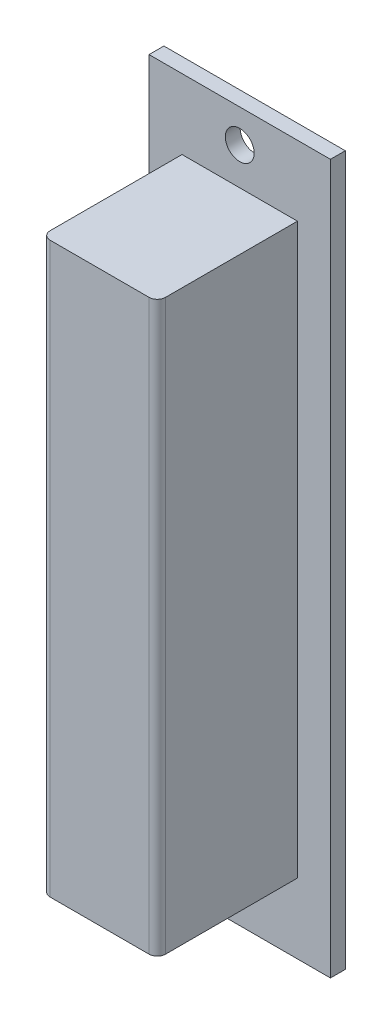
ISO-10303-21;
HEADER;
FILE_DESCRIPTION(('STEP AP214'),'2;1');
FILE_NAME('part.step','',(''),(''),'','','');
FILE_SCHEMA(('AUTOMOTIVE_DESIGN { 1 0 10303 214 1 1 1 1 }'));
ENDSEC;
DATA;
#1=APPLICATION_CONTEXT('core data for automotive mechanical design processes');
#2=APPLICATION_PROTOCOL_DEFINITION('international standard','automotive_design',2000,#1);
#3=PRODUCT_CONTEXT('',#1,'mechanical');
#4=PRODUCT('Part','Part','',(#3));
#5=PRODUCT_RELATED_PRODUCT_CATEGORY('part','',(#4));
#6=PRODUCT_DEFINITION_FORMATION('','',#4);
#7=PRODUCT_DEFINITION_CONTEXT('part definition',#1,'design');
#8=PRODUCT_DEFINITION('design','',#6,#7);
#9=PRODUCT_DEFINITION_SHAPE('','',#8);
#10=(LENGTH_UNIT() NAMED_UNIT(*) SI_UNIT(.MILLI.,.METRE.));
#11=(NAMED_UNIT(*) PLANE_ANGLE_UNIT() SI_UNIT($,.RADIAN.));
#12=(NAMED_UNIT(*) SI_UNIT($,.STERADIAN.) SOLID_ANGLE_UNIT());
#13=UNCERTAINTY_MEASURE_WITH_UNIT(LENGTH_MEASURE(1.E-05),#10,'distance_accuracy_value','');
#14=(GEOMETRIC_REPRESENTATION_CONTEXT(3) GLOBAL_UNCERTAINTY_ASSIGNED_CONTEXT((#13)) GLOBAL_UNIT_ASSIGNED_CONTEXT((#10,
#11,#12)) REPRESENTATION_CONTEXT('',''));
#15=CARTESIAN_POINT('',(0.,0.,0.));
#16=DIRECTION('',(0.,0.,1.));
#17=DIRECTION('',(1.,0.,0.));
#18=AXIS2_PLACEMENT_3D('',#15,#16,#17);
#19=CARTESIAN_POINT('',(-11.,-43.,1.8));
#20=DIRECTION('',(0.,0.,1.));
#21=DIRECTION('',(1.,0.,0.));
#22=AXIS2_PLACEMENT_3D('',#19,#20,#21);
#23=PLANE('',#22);
#24=CARTESIAN_POINT('',(0.,-39.,1.8));
#25=DIRECTION('',(0.,0.,1.));
#26=DIRECTION('',(-1.,0.,0.));
#27=AXIS2_PLACEMENT_3D('',#24,#25,#26);
#28=CIRCLE('',#27,1.75);
#29=CARTESIAN_POINT('',(-1.75,-39.,1.8));
#30=VERTEX_POINT('',#29);
#31=EDGE_CURVE('E141',#30,#30,#28,.T.);
#32=ORIENTED_EDGE('',*,*,#31,.F.);
#33=EDGE_LOOP('',(#32));
#34=FACE_BOUND('',#33,.T.);
#35=DIRECTION('',(0.,-1.,0.));
#36=VECTOR('',#35,1.);
#37=CARTESIAN_POINT('',(-11.,43.,1.8));
#38=LINE('',#37,#36);
#39=CARTESIAN_POINT('',(-11.,43.,1.8));
#40=VERTEX_POINT('',#39);
#41=CARTESIAN_POINT('',(-11.,-43.,1.8));
#42=VERTEX_POINT('',#41);
#43=EDGE_CURVE('E159',#40,#42,#38,.T.);
#44=ORIENTED_EDGE('',*,*,#43,.T.);
#45=DIRECTION('',(1.,0.,0.));
#46=VECTOR('',#45,1.);
#47=CARTESIAN_POINT('',(-11.,-43.,1.8));
#48=LINE('',#47,#46);
#49=CARTESIAN_POINT('',(11.,-43.,1.8));
#50=VERTEX_POINT('',#49);
#51=EDGE_CURVE('E162',#42,#50,#48,.T.);
#52=ORIENTED_EDGE('',*,*,#51,.T.);
#53=DIRECTION('',(0.,1.,0.));
#54=VECTOR('',#53,1.);
#55=CARTESIAN_POINT('',(11.,-43.,1.8));
#56=LINE('',#55,#54);
#57=CARTESIAN_POINT('',(11.,43.,1.8));
#58=VERTEX_POINT('',#57);
#59=EDGE_CURVE('E164',#50,#58,#56,.T.);
#60=ORIENTED_EDGE('',*,*,#59,.T.);
#61=DIRECTION('',(-1.,0.,0.));
#62=VECTOR('',#61,1.);
#63=CARTESIAN_POINT('',(-11.,43.,1.8));
#64=LINE('',#63,#62);
#65=EDGE_CURVE('E166',#58,#40,#64,.T.);
#66=ORIENTED_EDGE('',*,*,#65,.T.);
#67=EDGE_LOOP('',(#44,#52,#60,#66));
#68=FACE_BOUND('',#67,.T.);
#69=CARTESIAN_POINT('',(0.,39.,1.8));
#70=DIRECTION('',(0.,0.,1.));
#71=DIRECTION('',(1.,0.,0.));
#72=AXIS2_PLACEMENT_3D('',#69,#70,#71);
#73=CIRCLE('',#72,1.75);
#74=CARTESIAN_POINT('',(1.75,39.,1.8));
#75=VERTEX_POINT('',#74);
#76=EDGE_CURVE('E147',#75,#75,#73,.T.);
#77=ORIENTED_EDGE('',*,*,#76,.F.);
#78=EDGE_LOOP('',(#77));
#79=FACE_BOUND('',#78,.T.);
#80=DIRECTION('',(1.,0.,0.));
#81=VECTOR('',#80,1.);
#82=CARTESIAN_POINT('',(-7.,-34.5,1.8));
#83=LINE('',#82,#81);
#84=CARTESIAN_POINT('',(-7.,-34.5,1.8));
#85=VERTEX_POINT('',#84);
#86=CARTESIAN_POINT('',(7.00000000000002,-34.5,1.8));
#87=VERTEX_POINT('',#86);
#88=EDGE_CURVE('E108',#85,#87,#83,.T.);
#89=ORIENTED_EDGE('',*,*,#88,.F.);
#90=DIRECTION('',(0.,-1.,0.));
#91=VECTOR('',#90,1.);
#92=CARTESIAN_POINT('',(-7.,34.5,1.8));
#93=LINE('',#92,#91);
#94=CARTESIAN_POINT('',(-7.,34.5,1.8));
#95=VERTEX_POINT('',#94);
#96=EDGE_CURVE('E115',#95,#85,#93,.T.);
#97=ORIENTED_EDGE('',*,*,#96,.F.);
#98=DIRECTION('',(-1.,0.,0.));
#99=VECTOR('',#98,1.);
#100=CARTESIAN_POINT('',(-7.,34.5,1.8));
#101=LINE('',#100,#99);
#102=CARTESIAN_POINT('',(6.99999999999999,34.5,1.8));
#103=VERTEX_POINT('',#102);
#104=EDGE_CURVE('E125',#103,#95,#101,.T.);
#105=ORIENTED_EDGE('',*,*,#104,.F.);
#106=DIRECTION('',(0.,1.,0.));
#107=VECTOR('',#106,1.);
#108=CARTESIAN_POINT('',(7.00000000000002,-34.5,1.8));
#109=LINE('',#108,#107);
#110=EDGE_CURVE('E123',#87,#103,#109,.T.);
#111=ORIENTED_EDGE('',*,*,#110,.F.);
#112=EDGE_LOOP('',(#89,#97,#105,#111));
#113=FACE_BOUND('',#112,.T.);
#114=ADVANCED_FACE('F26',(#34,#68,#79,#113),#23,.T.);
#115=CARTESIAN_POINT('',(-11.,-43.,0.));
#116=DIRECTION('',(0.,0.,1.));
#117=DIRECTION('',(1.,0.,0.));
#118=AXIS2_PLACEMENT_3D('',#115,#116,#117);
#119=PLANE('',#118);
#120=CARTESIAN_POINT('',(0.,39.,0.));
#121=DIRECTION('',(0.,0.,1.));
#122=DIRECTION('',(1.,0.,0.));
#123=AXIS2_PLACEMENT_3D('',#120,#121,#122);
#124=CIRCLE('',#123,1.75);
#125=CARTESIAN_POINT('',(1.75,39.,0.));
#126=VERTEX_POINT('',#125);
#127=EDGE_CURVE('E144',#126,#126,#124,.T.);
#128=ORIENTED_EDGE('',*,*,#127,.T.);
#129=EDGE_LOOP('',(#128));
#130=FACE_BOUND('',#129,.T.);
#131=DIRECTION('',(0.,-1.,0.));
#132=VECTOR('',#131,1.);
#133=CARTESIAN_POINT('',(-11.,43.,0.));
#134=LINE('',#133,#132);
#135=CARTESIAN_POINT('',(-11.,43.,0.));
#136=VERTEX_POINT('',#135);
#137=CARTESIAN_POINT('',(-11.,-43.,0.));
#138=VERTEX_POINT('',#137);
#139=EDGE_CURVE('E150',#136,#138,#134,.T.);
#140=ORIENTED_EDGE('',*,*,#139,.F.);
#141=DIRECTION('',(-1.,0.,0.));
#142=VECTOR('',#141,1.);
#143=CARTESIAN_POINT('',(-11.,43.,0.));
#144=LINE('',#143,#142);
#145=CARTESIAN_POINT('',(11.,43.,0.));
#146=VERTEX_POINT('',#145);
#147=EDGE_CURVE('E157',#146,#136,#144,.T.);
#148=ORIENTED_EDGE('',*,*,#147,.F.);
#149=DIRECTION('',(0.,1.,0.));
#150=VECTOR('',#149,1.);
#151=CARTESIAN_POINT('',(11.,-43.,0.));
#152=LINE('',#151,#150);
#153=CARTESIAN_POINT('',(11.,-43.,0.));
#154=VERTEX_POINT('',#153);
#155=EDGE_CURVE('E155',#154,#146,#152,.T.);
#156=ORIENTED_EDGE('',*,*,#155,.F.);
#157=DIRECTION('',(1.,0.,0.));
#158=VECTOR('',#157,1.);
#159=CARTESIAN_POINT('',(-11.,-43.,0.));
#160=LINE('',#159,#158);
#161=EDGE_CURVE('E153',#138,#154,#160,.T.);
#162=ORIENTED_EDGE('',*,*,#161,.F.);
#163=EDGE_LOOP('',(#140,#148,#156,#162));
#164=FACE_BOUND('',#163,.T.);
#165=CARTESIAN_POINT('',(0.,-39.,0.));
#166=DIRECTION('',(0.,0.,1.));
#167=DIRECTION('',(-1.,0.,0.));
#168=AXIS2_PLACEMENT_3D('',#165,#166,#167);
#169=CIRCLE('',#168,1.75);
#170=CARTESIAN_POINT('',(-1.75,-39.,0.));
#171=VERTEX_POINT('',#170);
#172=EDGE_CURVE('E111',#171,#171,#169,.T.);
#173=ORIENTED_EDGE('',*,*,#172,.T.);
#174=EDGE_LOOP('',(#173));
#175=FACE_BOUND('',#174,.T.);
#176=ADVANCED_FACE('F209',(#130,#164,#175),#119,.F.);
#177=CARTESIAN_POINT('',(-11.,43.,1.8));
#178=DIRECTION('',(1.,0.,0.));
#179=DIRECTION('',(0.,1.,0.));
#180=AXIS2_PLACEMENT_3D('',#177,#178,#179);
#181=PLANE('',#180);
#182=ORIENTED_EDGE('',*,*,#139,.T.);
#183=DIRECTION('',(0.,0.,-1.));
#184=VECTOR('',#183,1.);
#185=CARTESIAN_POINT('',(-11.,-43.,1.8));
#186=LINE('',#185,#184);
#187=EDGE_CURVE('E177',#42,#138,#186,.T.);
#188=ORIENTED_EDGE('',*,*,#187,.F.);
#189=ORIENTED_EDGE('',*,*,#43,.F.);
#190=DIRECTION('',(0.,0.,-1.));
#191=VECTOR('',#190,1.);
#192=CARTESIAN_POINT('',(-11.,43.,1.8));
#193=LINE('',#192,#191);
#194=EDGE_CURVE('E168',#40,#136,#193,.T.);
#195=ORIENTED_EDGE('',*,*,#194,.T.);
#196=EDGE_LOOP('',(#182,#188,#189,#195));
#197=FACE_BOUND('',#196,.T.);
#198=ADVANCED_FACE('F28',(#197),#181,.F.);
#199=CARTESIAN_POINT('',(-11.,-43.,1.8));
#200=DIRECTION('',(0.,1.,0.));
#201=DIRECTION('',(0.,0.,1.));
#202=AXIS2_PLACEMENT_3D('',#199,#200,#201);
#203=PLANE('',#202);
#204=ORIENTED_EDGE('',*,*,#161,.T.);
#205=DIRECTION('',(0.,0.,-1.));
#206=VECTOR('',#205,1.);
#207=CARTESIAN_POINT('',(11.,-43.,1.8));
#208=LINE('',#207,#206);
#209=EDGE_CURVE('E174',#50,#154,#208,.T.);
#210=ORIENTED_EDGE('',*,*,#209,.F.);
#211=ORIENTED_EDGE('',*,*,#51,.F.);
#212=ORIENTED_EDGE('',*,*,#187,.T.);
#213=EDGE_LOOP('',(#204,#210,#211,#212));
#214=FACE_BOUND('',#213,.T.);
#215=ADVANCED_FACE('F230',(#214),#203,.F.);
#216=CARTESIAN_POINT('',(11.,-43.,1.8));
#217=DIRECTION('',(-1.,0.,0.));
#218=DIRECTION('',(0.,-1.,0.));
#219=AXIS2_PLACEMENT_3D('',#216,#217,#218);
#220=PLANE('',#219);
#221=ORIENTED_EDGE('',*,*,#155,.T.);
#222=DIRECTION('',(0.,0.,-1.));
#223=VECTOR('',#222,1.);
#224=CARTESIAN_POINT('',(11.,43.,1.8));
#225=LINE('',#224,#223);
#226=EDGE_CURVE('E171',#58,#146,#225,.T.);
#227=ORIENTED_EDGE('',*,*,#226,.F.);
#228=ORIENTED_EDGE('',*,*,#59,.F.);
#229=ORIENTED_EDGE('',*,*,#209,.T.);
#230=EDGE_LOOP('',(#221,#227,#228,#229));
#231=FACE_BOUND('',#230,.T.);
#232=ADVANCED_FACE('F227',(#231),#220,.F.);
#233=CARTESIAN_POINT('',(-11.,43.,1.8));
#234=DIRECTION('',(0.,-1.,0.));
#235=DIRECTION('',(0.,0.,-1.));
#236=AXIS2_PLACEMENT_3D('',#233,#234,#235);
#237=PLANE('',#236);
#238=ORIENTED_EDGE('',*,*,#147,.T.);
#239=ORIENTED_EDGE('',*,*,#194,.F.);
#240=ORIENTED_EDGE('',*,*,#65,.F.);
#241=ORIENTED_EDGE('',*,*,#226,.T.);
#242=EDGE_LOOP('',(#238,#239,#240,#241));
#243=FACE_BOUND('',#242,.T.);
#244=ADVANCED_FACE('F223',(#243),#237,.F.);
#245=CARTESIAN_POINT('',(0.,39.,1.8));
#246=DIRECTION('',(0.,0.,-1.));
#247=DIRECTION('',(-1.,0.,0.));
#248=AXIS2_PLACEMENT_3D('',#245,#246,#247);
#249=CYLINDRICAL_SURFACE('',#248,1.75);
#250=ORIENTED_EDGE('',*,*,#76,.T.);
#251=EDGE_LOOP('',(#250));
#252=FACE_BOUND('',#251,.T.);
#253=ORIENTED_EDGE('',*,*,#127,.F.);
#254=EDGE_LOOP('',(#253));
#255=FACE_BOUND('',#254,.T.);
#256=ADVANCED_FACE('F226',(#252,#255),#249,.F.);
#257=CARTESIAN_POINT('',(0.,-39.,1.8));
#258=DIRECTION('',(0.,0.,-1.));
#259=DIRECTION('',(-1.,0.,0.));
#260=AXIS2_PLACEMENT_3D('',#257,#258,#259);
#261=CYLINDRICAL_SURFACE('',#260,1.75);
#262=ORIENTED_EDGE('',*,*,#31,.T.);
#263=EDGE_LOOP('',(#262));
#264=FACE_BOUND('',#263,.T.);
#265=ORIENTED_EDGE('',*,*,#172,.F.);
#266=EDGE_LOOP('',(#265));
#267=FACE_BOUND('',#266,.T.);
#268=ADVANCED_FACE('F255',(#264,#267),#261,.F.);
#269=CARTESIAN_POINT('',(-7.,34.5,18.8));
#270=DIRECTION('',(1.,0.,0.));
#271=DIRECTION('',(0.,1.,0.));
#272=AXIS2_PLACEMENT_3D('',#269,#270,#271);
#273=PLANE('',#272);
#274=DIRECTION('',(0.,0.,-1.));
#275=VECTOR('',#274,1.);
#276=CARTESIAN_POINT('',(-7.,-34.5,18.8));
#277=LINE('',#276,#275);
#278=CARTESIAN_POINT('',(-7.,-34.5,17.8));
#279=VERTEX_POINT('',#278);
#280=EDGE_CURVE('E102',#279,#85,#277,.T.);
#281=ORIENTED_EDGE('',*,*,#280,.F.);
#282=DIRECTION('',(0.,-1.,0.));
#283=VECTOR('',#282,1.);
#284=CARTESIAN_POINT('',(-7.,34.5,17.8));
#285=LINE('',#284,#283);
#286=CARTESIAN_POINT('',(-7.,34.5,17.8));
#287=VERTEX_POINT('',#286);
#288=EDGE_CURVE('E49',#279,#287,#285,.F.);
#289=ORIENTED_EDGE('',*,*,#288,.T.);
#290=DIRECTION('',(0.,0.,-1.));
#291=VECTOR('',#290,1.);
#292=CARTESIAN_POINT('',(-7.,34.5,18.8));
#293=LINE('',#292,#291);
#294=EDGE_CURVE('E117',#287,#95,#293,.T.);
#295=ORIENTED_EDGE('',*,*,#294,.T.);
#296=ORIENTED_EDGE('',*,*,#96,.T.);
#297=EDGE_LOOP('',(#281,#289,#295,#296));
#298=FACE_BOUND('',#297,.T.);
#299=ADVANCED_FACE('F116',(#298),#273,.F.);
#300=CARTESIAN_POINT('',(-7.,-34.5,18.8));
#301=DIRECTION('',(0.,1.,0.));
#302=DIRECTION('',(0.,0.,1.));
#303=AXIS2_PLACEMENT_3D('',#300,#301,#302);
#304=PLANE('',#303);
#305=DIRECTION('',(1.,0.,0.));
#306=VECTOR('',#305,1.);
#307=CARTESIAN_POINT('',(-7.,-34.5,18.8));
#308=LINE('',#307,#306);
#309=CARTESIAN_POINT('',(-6.,-34.5,18.8));
#310=VERTEX_POINT('',#309);
#311=CARTESIAN_POINT('',(6.00000000000002,-34.5,18.8));
#312=VERTEX_POINT('',#311);
#313=EDGE_CURVE('E129',#310,#312,#308,.T.);
#314=ORIENTED_EDGE('',*,*,#313,.F.);
#315=CARTESIAN_POINT('',(-6.,-34.5,17.8));
#316=DIRECTION('',(0.,1.,0.));
#317=DIRECTION('',(0.,0.,1.));
#318=AXIS2_PLACEMENT_3D('',#315,#316,#317);
#319=CIRCLE('',#318,1.);
#320=EDGE_CURVE('E110',#310,#279,#319,.F.);
#321=ORIENTED_EDGE('',*,*,#320,.T.);
#322=ORIENTED_EDGE('',*,*,#280,.T.);
#323=ORIENTED_EDGE('',*,*,#88,.T.);
#324=DIRECTION('',(0.,0.,-1.));
#325=VECTOR('',#324,1.);
#326=CARTESIAN_POINT('',(7.00000000000002,-34.5,18.8));
#327=LINE('',#326,#325);
#328=CARTESIAN_POINT('',(7.00000000000002,-34.5,17.8));
#329=VERTEX_POINT('',#328);
#330=EDGE_CURVE('E112',#329,#87,#327,.T.);
#331=ORIENTED_EDGE('',*,*,#330,.F.);
#332=CARTESIAN_POINT('',(6.00000000000002,-34.5,17.8));
#333=DIRECTION('',(0.,1.,0.));
#334=DIRECTION('',(0.,0.,1.));
#335=AXIS2_PLACEMENT_3D('',#332,#333,#334);
#336=CIRCLE('',#335,1.);
#337=EDGE_CURVE('E186',#329,#312,#336,.F.);
#338=ORIENTED_EDGE('',*,*,#337,.T.);
#339=EDGE_LOOP('',(#314,#321,#322,#323,#331,#338));
#340=FACE_BOUND('',#339,.T.);
#341=ADVANCED_FACE('F105',(#340),#304,.F.);
#342=CARTESIAN_POINT('',(7.00000000000002,-34.5,18.8));
#343=DIRECTION('',(-1.,0.,0.));
#344=DIRECTION('',(0.,-1.,0.));
#345=AXIS2_PLACEMENT_3D('',#342,#343,#344);
#346=PLANE('',#345);
#347=DIRECTION('',(0.,0.,-1.));
#348=VECTOR('',#347,1.);
#349=CARTESIAN_POINT('',(7.,34.5,18.8));
#350=LINE('',#349,#348);
#351=CARTESIAN_POINT('',(7.,34.5,17.8));
#352=VERTEX_POINT('',#351);
#353=EDGE_CURVE('E136',#352,#103,#350,.T.);
#354=ORIENTED_EDGE('',*,*,#353,.F.);
#355=DIRECTION('',(0.,1.,0.));
#356=VECTOR('',#355,1.);
#357=CARTESIAN_POINT('',(7.00000000000002,-34.5,17.8));
#358=LINE('',#357,#356);
#359=EDGE_CURVE('E11',#352,#329,#358,.F.);
#360=ORIENTED_EDGE('',*,*,#359,.T.);
#361=ORIENTED_EDGE('',*,*,#330,.T.);
#362=ORIENTED_EDGE('',*,*,#110,.T.);
#363=EDGE_LOOP('',(#354,#360,#361,#362));
#364=FACE_BOUND('',#363,.T.);
#365=ADVANCED_FACE('F265',(#364),#346,.F.);
#366=CARTESIAN_POINT('',(-7.,34.5,18.8));
#367=DIRECTION('',(0.,-1.,0.));
#368=DIRECTION('',(0.,0.,-1.));
#369=AXIS2_PLACEMENT_3D('',#366,#367,#368);
#370=PLANE('',#369);
#371=ORIENTED_EDGE('',*,*,#294,.F.);
#372=CARTESIAN_POINT('',(-6.,34.5,17.8));
#373=DIRECTION('',(0.,-1.,0.));
#374=DIRECTION('',(0.,0.,-1.));
#375=AXIS2_PLACEMENT_3D('',#372,#373,#374);
#376=CIRCLE('',#375,1.);
#377=CARTESIAN_POINT('',(-6.,34.5,18.8));
#378=VERTEX_POINT('',#377);
#379=EDGE_CURVE('E34',#287,#378,#376,.F.);
#380=ORIENTED_EDGE('',*,*,#379,.T.);
#381=DIRECTION('',(-1.,0.,0.));
#382=VECTOR('',#381,1.);
#383=CARTESIAN_POINT('',(-7.,34.5,18.8));
#384=LINE('',#383,#382);
#385=CARTESIAN_POINT('',(6.,34.5,18.8));
#386=VERTEX_POINT('',#385);
#387=EDGE_CURVE('E132',#386,#378,#384,.T.);
#388=ORIENTED_EDGE('',*,*,#387,.F.);
#389=CARTESIAN_POINT('',(6.,34.5,17.8));
#390=DIRECTION('',(0.,-1.,0.));
#391=DIRECTION('',(0.,0.,-1.));
#392=AXIS2_PLACEMENT_3D('',#389,#390,#391);
#393=CIRCLE('',#392,1.);
#394=EDGE_CURVE('E41',#386,#352,#393,.F.);
#395=ORIENTED_EDGE('',*,*,#394,.T.);
#396=ORIENTED_EDGE('',*,*,#353,.T.);
#397=ORIENTED_EDGE('',*,*,#104,.T.);
#398=EDGE_LOOP('',(#371,#380,#388,#395,#396,#397));
#399=FACE_BOUND('',#398,.T.);
#400=ADVANCED_FACE('F191',(#399),#370,.F.);
#401=CARTESIAN_POINT('',(-7.,-34.5,18.8));
#402=DIRECTION('',(0.,0.,1.));
#403=DIRECTION('',(1.,0.,0.));
#404=AXIS2_PLACEMENT_3D('',#401,#402,#403);
#405=PLANE('',#404);
#406=ORIENTED_EDGE('',*,*,#387,.T.);
#407=DIRECTION('',(0.,-1.,0.));
#408=VECTOR('',#407,1.);
#409=CARTESIAN_POINT('',(-6.,-34.5,18.8));
#410=LINE('',#409,#408);
#411=EDGE_CURVE('E183',#378,#310,#410,.T.);
#412=ORIENTED_EDGE('',*,*,#411,.T.);
#413=ORIENTED_EDGE('',*,*,#313,.T.);
#414=DIRECTION('',(0.,1.,0.));
#415=VECTOR('',#414,1.);
#416=CARTESIAN_POINT('',(6.,34.5,18.8));
#417=LINE('',#416,#415);
#418=EDGE_CURVE('E180',#312,#386,#417,.T.);
#419=ORIENTED_EDGE('',*,*,#418,.T.);
#420=EDGE_LOOP('',(#406,#412,#413,#419));
#421=FACE_BOUND('',#420,.T.);
#422=ADVANCED_FACE('F195',(#421),#405,.T.);
#423=CARTESIAN_POINT('',(-6.,-34.5,17.8));
#424=DIRECTION('',(0.,1.,0.));
#425=DIRECTION('',(-1.,0.,0.));
#426=AXIS2_PLACEMENT_3D('',#423,#424,#425);
#427=CYLINDRICAL_SURFACE('',#426,1.);
#428=ORIENTED_EDGE('',*,*,#379,.F.);
#429=ORIENTED_EDGE('',*,*,#288,.F.);
#430=ORIENTED_EDGE('',*,*,#320,.F.);
#431=ORIENTED_EDGE('',*,*,#411,.F.);
#432=EDGE_LOOP('',(#428,#429,#430,#431));
#433=FACE_BOUND('',#432,.T.);
#434=ADVANCED_FACE('F197',(#433),#427,.T.);
#435=CARTESIAN_POINT('',(6.00000000000002,-34.5,17.8));
#436=DIRECTION('',(0.,-1.,0.));
#437=DIRECTION('',(1.,0.,0.));
#438=AXIS2_PLACEMENT_3D('',#435,#436,#437);
#439=CYLINDRICAL_SURFACE('',#438,1.);
#440=ORIENTED_EDGE('',*,*,#337,.F.);
#441=ORIENTED_EDGE('',*,*,#359,.F.);
#442=ORIENTED_EDGE('',*,*,#394,.F.);
#443=ORIENTED_EDGE('',*,*,#418,.F.);
#444=EDGE_LOOP('',(#440,#441,#442,#443));
#445=FACE_BOUND('',#444,.T.);
#446=ADVANCED_FACE('F199',(#445),#439,.T.);
#447=CLOSED_SHELL('',(#114,#176,#198,#215,#232,#244,#256,#268,#299,#341,#365,#400,#422,#434,#446));
#448=MANIFOLD_SOLID_BREP('B2',#447);
#449=ADVANCED_BREP_SHAPE_REPRESENTATION('',(#18,#448),#14);
#450=SHAPE_DEFINITION_REPRESENTATION(#9,#449);
ENDSEC;
END-ISO-10303-21;
